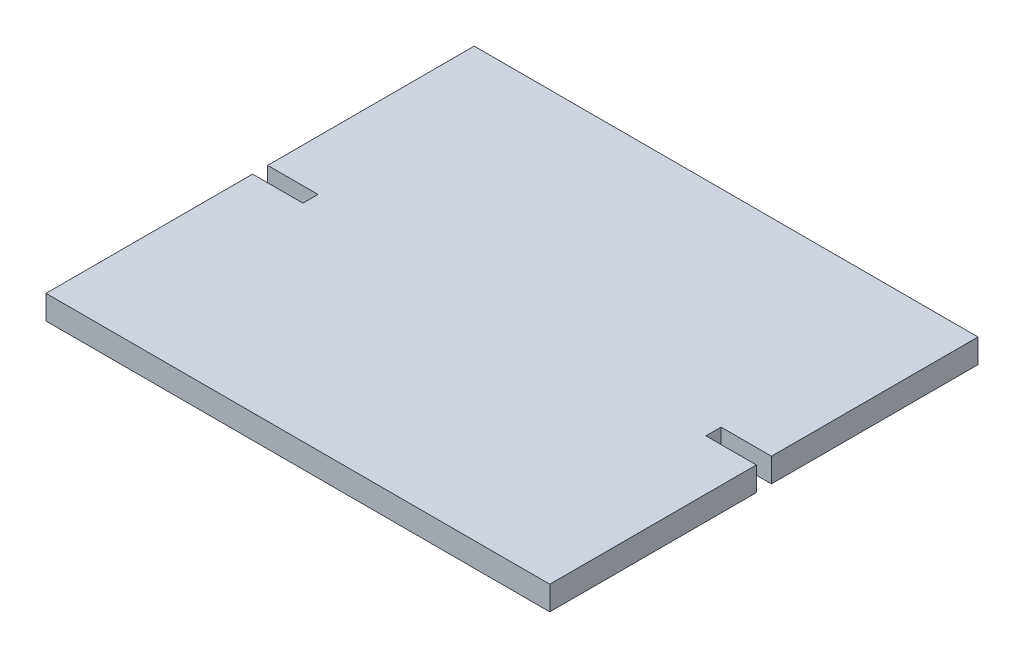
ISO-10303-21;
HEADER;
FILE_DESCRIPTION(('STEP AP214'),'2;1');
FILE_NAME('part.step','',(''),(''),'','','');
FILE_SCHEMA(('AUTOMOTIVE_DESIGN { 1 0 10303 214 1 1 1 1 }'));
ENDSEC;
DATA;
#1=APPLICATION_CONTEXT('core data for automotive mechanical design processes');
#2=APPLICATION_PROTOCOL_DEFINITION('international standard','automotive_design',2000,#1);
#3=PRODUCT_CONTEXT('',#1,'mechanical');
#4=PRODUCT('Part','Part','',(#3));
#5=PRODUCT_RELATED_PRODUCT_CATEGORY('part','',(#4));
#6=PRODUCT_DEFINITION_FORMATION('','',#4);
#7=PRODUCT_DEFINITION_CONTEXT('part definition',#1,'design');
#8=PRODUCT_DEFINITION('design','',#6,#7);
#9=PRODUCT_DEFINITION_SHAPE('','',#8);
#10=(LENGTH_UNIT() NAMED_UNIT(*) SI_UNIT(.MILLI.,.METRE.));
#11=(NAMED_UNIT(*) PLANE_ANGLE_UNIT() SI_UNIT($,.RADIAN.));
#12=(NAMED_UNIT(*) SI_UNIT($,.STERADIAN.) SOLID_ANGLE_UNIT());
#13=UNCERTAINTY_MEASURE_WITH_UNIT(LENGTH_MEASURE(1.E-05),#10,'distance_accuracy_value','');
#14=(GEOMETRIC_REPRESENTATION_CONTEXT(3) GLOBAL_UNCERTAINTY_ASSIGNED_CONTEXT((#13)) GLOBAL_UNIT_ASSIGNED_CONTEXT((#10,
#11,#12)) REPRESENTATION_CONTEXT('',''));
#15=CARTESIAN_POINT('',(0.,0.,0.));
#16=DIRECTION('',(0.,0.,1.));
#17=DIRECTION('',(1.,0.,0.));
#18=AXIS2_PLACEMENT_3D('',#15,#16,#17);
#19=CARTESIAN_POINT('',(50.0000000000001,-4.7625,-42.4999999999999));
#20=DIRECTION('',(1.,0.,0.));
#21=DIRECTION('',(0.,0.,-1.));
#22=AXIS2_PLACEMENT_3D('',#19,#20,#21);
#23=PLANE('',#22);
#24=DIRECTION('',(0.,0.,-1.));
#25=VECTOR('',#24,1.);
#26=CARTESIAN_POINT('',(50.0000000000001,0.,-42.4999999999999));
#27=LINE('',#26,#25);
#28=CARTESIAN_POINT('',(50.,0.,-1.5));
#29=VERTEX_POINT('',#28);
#30=CARTESIAN_POINT('',(50.0000000000001,0.,-42.4999999999999));
#31=VERTEX_POINT('',#30);
#32=EDGE_CURVE('E156',#29,#31,#27,.T.);
#33=ORIENTED_EDGE('',*,*,#32,.F.);
#34=DIRECTION('',(0.,1.,0.));
#35=VECTOR('',#34,1.);
#36=CARTESIAN_POINT('',(50.,-4.7625,-1.5));
#37=LINE('',#36,#35);
#38=CARTESIAN_POINT('',(50.,-4.7625,-1.5));
#39=VERTEX_POINT('',#38);
#40=EDGE_CURVE('E11',#39,#29,#37,.T.);
#41=ORIENTED_EDGE('',*,*,#40,.F.);
#42=DIRECTION('',(0.,0.,-1.));
#43=VECTOR('',#42,1.);
#44=CARTESIAN_POINT('',(50.0000000000001,-4.7625,-42.4999999999999));
#45=LINE('',#44,#43);
#46=CARTESIAN_POINT('',(50.0000000000001,-4.7625,-42.4999999999999));
#47=VERTEX_POINT('',#46);
#48=EDGE_CURVE('E188',#39,#47,#45,.T.);
#49=ORIENTED_EDGE('',*,*,#48,.T.);
#50=DIRECTION('',(0.,1.,0.));
#51=VECTOR('',#50,1.);
#52=CARTESIAN_POINT('',(50.0000000000001,-4.7625,-42.4999999999999));
#53=LINE('',#52,#51);
#54=EDGE_CURVE('E38',#47,#31,#53,.T.);
#55=ORIENTED_EDGE('',*,*,#54,.T.);
#56=EDGE_LOOP('',(#33,#41,#49,#55));
#57=FACE_BOUND('',#56,.T.);
#58=ADVANCED_FACE('F35',(#57),#23,.T.);
#59=CARTESIAN_POINT('',(50.,-4.7625,-1.5));
#60=DIRECTION('',(0.,0.,1.));
#61=DIRECTION('',(1.,0.,0.));
#62=AXIS2_PLACEMENT_3D('',#59,#60,#61);
#63=PLANE('',#62);
#64=DIRECTION('',(1.,0.,0.));
#65=VECTOR('',#64,1.);
#66=CARTESIAN_POINT('',(50.,0.,-1.5));
#67=LINE('',#66,#65);
#68=CARTESIAN_POINT('',(40.,0.,-1.5));
#69=VERTEX_POINT('',#68);
#70=EDGE_CURVE('E186',#69,#29,#67,.T.);
#71=ORIENTED_EDGE('',*,*,#70,.F.);
#72=DIRECTION('',(0.,1.,0.));
#73=VECTOR('',#72,1.);
#74=CARTESIAN_POINT('',(40.,-4.7625,-1.5));
#75=LINE('',#74,#73);
#76=CARTESIAN_POINT('',(40.,-4.7625,-1.5));
#77=VERTEX_POINT('',#76);
#78=EDGE_CURVE('E44',#77,#69,#75,.T.);
#79=ORIENTED_EDGE('',*,*,#78,.F.);
#80=DIRECTION('',(1.,0.,0.));
#81=VECTOR('',#80,1.);
#82=CARTESIAN_POINT('',(50.,-4.7625,-1.5));
#83=LINE('',#82,#81);
#84=EDGE_CURVE('E146',#77,#39,#83,.T.);
#85=ORIENTED_EDGE('',*,*,#84,.T.);
#86=ORIENTED_EDGE('',*,*,#40,.T.);
#87=EDGE_LOOP('',(#71,#79,#85,#86));
#88=FACE_BOUND('',#87,.T.);
#89=ADVANCED_FACE('F208',(#88),#63,.T.);
#90=CARTESIAN_POINT('',(40.,-4.7625,-1.5));
#91=DIRECTION('',(1.,0.,0.));
#92=DIRECTION('',(0.,0.,-1.));
#93=AXIS2_PLACEMENT_3D('',#90,#91,#92);
#94=PLANE('',#93);
#95=DIRECTION('',(0.,0.,-1.));
#96=VECTOR('',#95,1.);
#97=CARTESIAN_POINT('',(40.,0.,-1.5));
#98=LINE('',#97,#96);
#99=CARTESIAN_POINT('',(40.,0.,1.5));
#100=VERTEX_POINT('',#99);
#101=EDGE_CURVE('E133',#100,#69,#98,.T.);
#102=ORIENTED_EDGE('',*,*,#101,.F.);
#103=DIRECTION('',(0.,1.,0.));
#104=VECTOR('',#103,1.);
#105=CARTESIAN_POINT('',(40.,-4.7625,1.5));
#106=LINE('',#105,#104);
#107=CARTESIAN_POINT('',(40.,-4.7625,1.5));
#108=VERTEX_POINT('',#107);
#109=EDGE_CURVE('E128',#108,#100,#106,.T.);
#110=ORIENTED_EDGE('',*,*,#109,.F.);
#111=DIRECTION('',(0.,0.,-1.));
#112=VECTOR('',#111,1.);
#113=CARTESIAN_POINT('',(40.,-4.7625,-1.5));
#114=LINE('',#113,#112);
#115=EDGE_CURVE('E131',#108,#77,#114,.T.);
#116=ORIENTED_EDGE('',*,*,#115,.T.);
#117=ORIENTED_EDGE('',*,*,#78,.T.);
#118=EDGE_LOOP('',(#102,#110,#116,#117));
#119=FACE_BOUND('',#118,.T.);
#120=ADVANCED_FACE('F130',(#119),#94,.T.);
#121=CARTESIAN_POINT('',(50.,-4.7625,1.5));
#122=DIRECTION('',(0.,0.,-1.));
#123=DIRECTION('',(-1.,0.,0.));
#124=AXIS2_PLACEMENT_3D('',#121,#122,#123);
#125=PLANE('',#124);
#126=DIRECTION('',(-1.,0.,0.));
#127=VECTOR('',#126,1.);
#128=CARTESIAN_POINT('',(50.,0.,1.5));
#129=LINE('',#128,#127);
#130=CARTESIAN_POINT('',(50.,0.,1.5));
#131=VERTEX_POINT('',#130);
#132=EDGE_CURVE('E183',#131,#100,#129,.T.);
#133=ORIENTED_EDGE('',*,*,#132,.F.);
#134=DIRECTION('',(0.,1.,0.));
#135=VECTOR('',#134,1.);
#136=CARTESIAN_POINT('',(50.,-4.7625,1.5));
#137=LINE('',#136,#135);
#138=CARTESIAN_POINT('',(50.,-4.7625,1.5));
#139=VERTEX_POINT('',#138);
#140=EDGE_CURVE('E138',#139,#131,#137,.T.);
#141=ORIENTED_EDGE('',*,*,#140,.F.);
#142=DIRECTION('',(-1.,0.,0.));
#143=VECTOR('',#142,1.);
#144=CARTESIAN_POINT('',(50.,-4.7625,1.5));
#145=LINE('',#144,#143);
#146=EDGE_CURVE('E144',#139,#108,#145,.T.);
#147=ORIENTED_EDGE('',*,*,#146,.T.);
#148=ORIENTED_EDGE('',*,*,#109,.T.);
#149=EDGE_LOOP('',(#133,#141,#147,#148));
#150=FACE_BOUND('',#149,.T.);
#151=ADVANCED_FACE('F148',(#150),#125,.T.);
#152=CARTESIAN_POINT('',(50.,-4.7625,1.5));
#153=DIRECTION('',(1.,0.,0.));
#154=DIRECTION('',(0.,0.,-1.));
#155=AXIS2_PLACEMENT_3D('',#152,#153,#154);
#156=PLANE('',#155);
#157=DIRECTION('',(0.,0.,-1.));
#158=VECTOR('',#157,1.);
#159=CARTESIAN_POINT('',(50.,0.,1.5));
#160=LINE('',#159,#158);
#161=CARTESIAN_POINT('',(49.9999999999999,0.,42.4999999999998));
#162=VERTEX_POINT('',#161);
#163=EDGE_CURVE('E180',#162,#131,#160,.T.);
#164=ORIENTED_EDGE('',*,*,#163,.F.);
#165=DIRECTION('',(0.,1.,0.));
#166=VECTOR('',#165,1.);
#167=CARTESIAN_POINT('',(49.9999999999999,-4.7625,42.4999999999998));
#168=LINE('',#167,#166);
#169=CARTESIAN_POINT('',(49.9999999999999,-4.7625,42.4999999999998));
#170=VERTEX_POINT('',#169);
#171=EDGE_CURVE('E192',#170,#162,#168,.T.);
#172=ORIENTED_EDGE('',*,*,#171,.F.);
#173=DIRECTION('',(0.,0.,-1.));
#174=VECTOR('',#173,1.);
#175=CARTESIAN_POINT('',(50.,-4.7625,1.5));
#176=LINE('',#175,#174);
#177=EDGE_CURVE('E149',#170,#139,#176,.T.);
#178=ORIENTED_EDGE('',*,*,#177,.T.);
#179=ORIENTED_EDGE('',*,*,#140,.T.);
#180=EDGE_LOOP('',(#164,#172,#178,#179));
#181=FACE_BOUND('',#180,.T.);
#182=ADVANCED_FACE('F221',(#181),#156,.T.);
#183=CARTESIAN_POINT('',(-49.9999999999999,-4.7625,42.5));
#184=DIRECTION('',(0.,0.,1.));
#185=DIRECTION('',(1.,0.,0.));
#186=AXIS2_PLACEMENT_3D('',#183,#184,#185);
#187=PLANE('',#186);
#188=DIRECTION('',(1.,0.,0.));
#189=VECTOR('',#188,1.);
#190=CARTESIAN_POINT('',(-49.9999999999999,0.,42.5));
#191=LINE('',#190,#189);
#192=CARTESIAN_POINT('',(-49.9999999999999,0.,42.5));
#193=VERTEX_POINT('',#192);
#194=EDGE_CURVE('E177',#193,#162,#191,.T.);
#195=ORIENTED_EDGE('',*,*,#194,.F.);
#196=DIRECTION('',(0.,1.,0.));
#197=VECTOR('',#196,1.);
#198=CARTESIAN_POINT('',(-49.9999999999999,-4.7625,42.5));
#199=LINE('',#198,#197);
#200=CARTESIAN_POINT('',(-49.9999999999999,-4.7625,42.5));
#201=VERTEX_POINT('',#200);
#202=EDGE_CURVE('E194',#201,#193,#199,.T.);
#203=ORIENTED_EDGE('',*,*,#202,.F.);
#204=DIRECTION('',(1.,0.,0.));
#205=VECTOR('',#204,1.);
#206=CARTESIAN_POINT('',(-49.9999999999999,-4.7625,42.5));
#207=LINE('',#206,#205);
#208=EDGE_CURVE('E151',#201,#170,#207,.T.);
#209=ORIENTED_EDGE('',*,*,#208,.T.);
#210=ORIENTED_EDGE('',*,*,#171,.T.);
#211=EDGE_LOOP('',(#195,#203,#209,#210));
#212=FACE_BOUND('',#211,.T.);
#213=ADVANCED_FACE('F224',(#212),#187,.T.);
#214=CARTESIAN_POINT('',(-50.,-4.7625,1.50000000000001));
#215=DIRECTION('',(-1.,0.,0.));
#216=DIRECTION('',(0.,0.,1.));
#217=AXIS2_PLACEMENT_3D('',#214,#215,#216);
#218=PLANE('',#217);
#219=DIRECTION('',(0.,0.,1.));
#220=VECTOR('',#219,1.);
#221=CARTESIAN_POINT('',(-50.,0.,1.50000000000001));
#222=LINE('',#221,#220);
#223=CARTESIAN_POINT('',(-50.,0.,1.50000000000001));
#224=VERTEX_POINT('',#223);
#225=EDGE_CURVE('E174',#224,#193,#222,.T.);
#226=ORIENTED_EDGE('',*,*,#225,.F.);
#227=DIRECTION('',(0.,1.,0.));
#228=VECTOR('',#227,1.);
#229=CARTESIAN_POINT('',(-50.,-4.7625,1.50000000000001));
#230=LINE('',#229,#228);
#231=CARTESIAN_POINT('',(-50.,-4.7625,1.50000000000001));
#232=VERTEX_POINT('',#231);
#233=EDGE_CURVE('E196',#232,#224,#230,.T.);
#234=ORIENTED_EDGE('',*,*,#233,.F.);
#235=DIRECTION('',(0.,0.,1.));
#236=VECTOR('',#235,1.);
#237=CARTESIAN_POINT('',(-50.,-4.7625,1.50000000000001));
#238=LINE('',#237,#236);
#239=EDGE_CURVE('E350',#232,#201,#238,.T.);
#240=ORIENTED_EDGE('',*,*,#239,.T.);
#241=ORIENTED_EDGE('',*,*,#202,.T.);
#242=EDGE_LOOP('',(#226,#234,#240,#241));
#243=FACE_BOUND('',#242,.T.);
#244=ADVANCED_FACE('F228',(#243),#218,.T.);
#245=CARTESIAN_POINT('',(-50.,-4.7625,1.50000000000001));
#246=DIRECTION('',(0.,0.,-1.));
#247=DIRECTION('',(-1.,0.,0.));
#248=AXIS2_PLACEMENT_3D('',#245,#246,#247);
#249=PLANE('',#248);
#250=DIRECTION('',(-1.,0.,0.));
#251=VECTOR('',#250,1.);
#252=CARTESIAN_POINT('',(-50.,0.,1.50000000000001));
#253=LINE('',#252,#251);
#254=CARTESIAN_POINT('',(-40.,0.,1.50000000000001));
#255=VERTEX_POINT('',#254);
#256=EDGE_CURVE('E171',#255,#224,#253,.T.);
#257=ORIENTED_EDGE('',*,*,#256,.F.);
#258=DIRECTION('',(0.,1.,0.));
#259=VECTOR('',#258,1.);
#260=CARTESIAN_POINT('',(-40.,-4.7625,1.50000000000001));
#261=LINE('',#260,#259);
#262=CARTESIAN_POINT('',(-40.,-4.7625,1.50000000000001));
#263=VERTEX_POINT('',#262);
#264=EDGE_CURVE('E198',#263,#255,#261,.T.);
#265=ORIENTED_EDGE('',*,*,#264,.F.);
#266=DIRECTION('',(-1.,0.,0.));
#267=VECTOR('',#266,1.);
#268=CARTESIAN_POINT('',(-50.,-4.7625,1.50000000000001));
#269=LINE('',#268,#267);
#270=EDGE_CURVE('E354',#263,#232,#269,.T.);
#271=ORIENTED_EDGE('',*,*,#270,.T.);
#272=ORIENTED_EDGE('',*,*,#233,.T.);
#273=EDGE_LOOP('',(#257,#265,#271,#272));
#274=FACE_BOUND('',#273,.T.);
#275=ADVANCED_FACE('F232',(#274),#249,.T.);
#276=CARTESIAN_POINT('',(-40.,-4.7625,-1.49999999999999));
#277=DIRECTION('',(-1.,0.,0.));
#278=DIRECTION('',(0.,0.,1.));
#279=AXIS2_PLACEMENT_3D('',#276,#277,#278);
#280=PLANE('',#279);
#281=DIRECTION('',(0.,0.,1.));
#282=VECTOR('',#281,1.);
#283=CARTESIAN_POINT('',(-40.,0.,-1.49999999999999));
#284=LINE('',#283,#282);
#285=CARTESIAN_POINT('',(-40.,0.,-1.49999999999999));
#286=VERTEX_POINT('',#285);
#287=EDGE_CURVE('E168',#286,#255,#284,.T.);
#288=ORIENTED_EDGE('',*,*,#287,.F.);
#289=DIRECTION('',(0.,1.,0.));
#290=VECTOR('',#289,1.);
#291=CARTESIAN_POINT('',(-40.,-4.7625,-1.49999999999999));
#292=LINE('',#291,#290);
#293=CARTESIAN_POINT('',(-40.,-4.7625,-1.49999999999999));
#294=VERTEX_POINT('',#293);
#295=EDGE_CURVE('E200',#294,#286,#292,.T.);
#296=ORIENTED_EDGE('',*,*,#295,.F.);
#297=DIRECTION('',(0.,0.,1.));
#298=VECTOR('',#297,1.);
#299=CARTESIAN_POINT('',(-40.,-4.7625,-1.49999999999999));
#300=LINE('',#299,#298);
#301=EDGE_CURVE('E343',#294,#263,#300,.T.);
#302=ORIENTED_EDGE('',*,*,#301,.T.);
#303=ORIENTED_EDGE('',*,*,#264,.T.);
#304=EDGE_LOOP('',(#288,#296,#302,#303));
#305=FACE_BOUND('',#304,.T.);
#306=ADVANCED_FACE('F236',(#305),#280,.T.);
#307=CARTESIAN_POINT('',(-50.,-4.7625,-1.49999999999999));
#308=DIRECTION('',(0.,0.,1.));
#309=DIRECTION('',(1.,0.,0.));
#310=AXIS2_PLACEMENT_3D('',#307,#308,#309);
#311=PLANE('',#310);
#312=DIRECTION('',(1.,0.,0.));
#313=VECTOR('',#312,1.);
#314=CARTESIAN_POINT('',(-50.,0.,-1.49999999999999));
#315=LINE('',#314,#313);
#316=CARTESIAN_POINT('',(-50.,0.,-1.49999999999999));
#317=VERTEX_POINT('',#316);
#318=EDGE_CURVE('E165',#317,#286,#315,.T.);
#319=ORIENTED_EDGE('',*,*,#318,.F.);
#320=DIRECTION('',(0.,1.,0.));
#321=VECTOR('',#320,1.);
#322=CARTESIAN_POINT('',(-50.,-4.7625,-1.49999999999999));
#323=LINE('',#322,#321);
#324=CARTESIAN_POINT('',(-50.,-4.7625,-1.49999999999999));
#325=VERTEX_POINT('',#324);
#326=EDGE_CURVE('E202',#325,#317,#323,.T.);
#327=ORIENTED_EDGE('',*,*,#326,.F.);
#328=DIRECTION('',(1.,0.,0.));
#329=VECTOR('',#328,1.);
#330=CARTESIAN_POINT('',(-50.,-4.7625,-1.49999999999999));
#331=LINE('',#330,#329);
#332=EDGE_CURVE('E339',#325,#294,#331,.T.);
#333=ORIENTED_EDGE('',*,*,#332,.T.);
#334=ORIENTED_EDGE('',*,*,#295,.T.);
#335=EDGE_LOOP('',(#319,#327,#333,#334));
#336=FACE_BOUND('',#335,.T.);
#337=ADVANCED_FACE('F240',(#336),#311,.T.);
#338=CARTESIAN_POINT('',(-49.9999999999999,-4.7625,-42.5));
#339=DIRECTION('',(-1.,0.,0.));
#340=DIRECTION('',(0.,0.,1.));
#341=AXIS2_PLACEMENT_3D('',#338,#339,#340);
#342=PLANE('',#341);
#343=DIRECTION('',(0.,0.,1.));
#344=VECTOR('',#343,1.);
#345=CARTESIAN_POINT('',(-49.9999999999999,0.,-42.5));
#346=LINE('',#345,#344);
#347=CARTESIAN_POINT('',(-49.9999999999999,0.,-42.5));
#348=VERTEX_POINT('',#347);
#349=EDGE_CURVE('E162',#348,#317,#346,.T.);
#350=ORIENTED_EDGE('',*,*,#349,.F.);
#351=DIRECTION('',(0.,1.,0.));
#352=VECTOR('',#351,1.);
#353=CARTESIAN_POINT('',(-49.9999999999999,-4.7625,-42.5));
#354=LINE('',#353,#352);
#355=CARTESIAN_POINT('',(-49.9999999999999,-4.7625,-42.5));
#356=VERTEX_POINT('',#355);
#357=EDGE_CURVE('E203',#356,#348,#354,.T.);
#358=ORIENTED_EDGE('',*,*,#357,.F.);
#359=DIRECTION('',(0.,0.,1.));
#360=VECTOR('',#359,1.);
#361=CARTESIAN_POINT('',(-49.9999999999999,-4.7625,-42.5));
#362=LINE('',#361,#360);
#363=EDGE_CURVE('E360',#356,#325,#362,.T.);
#364=ORIENTED_EDGE('',*,*,#363,.T.);
#365=ORIENTED_EDGE('',*,*,#326,.T.);
#366=EDGE_LOOP('',(#350,#358,#364,#365));
#367=FACE_BOUND('',#366,.T.);
#368=ADVANCED_FACE('F244',(#367),#342,.T.);
#369=CARTESIAN_POINT('',(-49.9999999999999,-4.7625,-42.5));
#370=DIRECTION('',(0.,0.,-1.));
#371=DIRECTION('',(-1.,0.,0.));
#372=AXIS2_PLACEMENT_3D('',#369,#370,#371);
#373=PLANE('',#372);
#374=DIRECTION('',(-1.,0.,0.));
#375=VECTOR('',#374,1.);
#376=CARTESIAN_POINT('',(-49.9999999999999,0.,-42.5));
#377=LINE('',#376,#375);
#378=EDGE_CURVE('E159',#31,#348,#377,.T.);
#379=ORIENTED_EDGE('',*,*,#378,.F.);
#380=ORIENTED_EDGE('',*,*,#54,.F.);
#381=DIRECTION('',(-1.,0.,0.));
#382=VECTOR('',#381,1.);
#383=CARTESIAN_POINT('',(-49.9999999999999,-4.7625,-42.5));
#384=LINE('',#383,#382);
#385=EDGE_CURVE('E362',#47,#356,#384,.T.);
#386=ORIENTED_EDGE('',*,*,#385,.T.);
#387=ORIENTED_EDGE('',*,*,#357,.T.);
#388=EDGE_LOOP('',(#379,#380,#386,#387));
#389=FACE_BOUND('',#388,.T.);
#390=ADVANCED_FACE('F205',(#389),#373,.T.);
#391=CARTESIAN_POINT('',(0.,-4.7625,0.));
#392=DIRECTION('',(0.,-1.,0.));
#393=DIRECTION('',(0.,0.,-1.));
#394=AXIS2_PLACEMENT_3D('',#391,#392,#393);
#395=PLANE('',#394);
#396=ORIENTED_EDGE('',*,*,#48,.F.);
#397=ORIENTED_EDGE('',*,*,#84,.F.);
#398=ORIENTED_EDGE('',*,*,#115,.F.);
#399=ORIENTED_EDGE('',*,*,#146,.F.);
#400=ORIENTED_EDGE('',*,*,#177,.F.);
#401=ORIENTED_EDGE('',*,*,#208,.F.);
#402=ORIENTED_EDGE('',*,*,#239,.F.);
#403=ORIENTED_EDGE('',*,*,#270,.F.);
#404=ORIENTED_EDGE('',*,*,#301,.F.);
#405=ORIENTED_EDGE('',*,*,#332,.F.);
#406=ORIENTED_EDGE('',*,*,#363,.F.);
#407=ORIENTED_EDGE('',*,*,#385,.F.);
#408=EDGE_LOOP('',(#396,#397,#398,#399,#400,#401,#402,#403,#404,#405,#406,#407));
#409=FACE_BOUND('',#408,.T.);
#410=ADVANCED_FACE('F142',(#409),#395,.T.);
#411=CARTESIAN_POINT('',(0.,0.,0.));
#412=DIRECTION('',(0.,-1.,0.));
#413=DIRECTION('',(0.,0.,-1.));
#414=AXIS2_PLACEMENT_3D('',#411,#412,#413);
#415=PLANE('',#414);
#416=ORIENTED_EDGE('',*,*,#32,.T.);
#417=ORIENTED_EDGE('',*,*,#378,.T.);
#418=ORIENTED_EDGE('',*,*,#349,.T.);
#419=ORIENTED_EDGE('',*,*,#318,.T.);
#420=ORIENTED_EDGE('',*,*,#287,.T.);
#421=ORIENTED_EDGE('',*,*,#256,.T.);
#422=ORIENTED_EDGE('',*,*,#225,.T.);
#423=ORIENTED_EDGE('',*,*,#194,.T.);
#424=ORIENTED_EDGE('',*,*,#163,.T.);
#425=ORIENTED_EDGE('',*,*,#132,.T.);
#426=ORIENTED_EDGE('',*,*,#101,.T.);
#427=ORIENTED_EDGE('',*,*,#70,.T.);
#428=EDGE_LOOP('',(#416,#417,#418,#419,#420,#421,#422,#423,#424,#425,#426,#427));
#429=FACE_BOUND('',#428,.T.);
#430=ADVANCED_FACE('F207',(#429),#415,.F.);
#431=CLOSED_SHELL('',(#58,#89,#120,#151,#182,#213,#244,#275,#306,#337,#368,#390,#410,#430));
#432=MANIFOLD_SOLID_BREP('B2',#431);
#433=ADVANCED_BREP_SHAPE_REPRESENTATION('',(#18,#432),#14);
#434=SHAPE_DEFINITION_REPRESENTATION(#9,#433);
ENDSEC;
END-ISO-10303-21;
